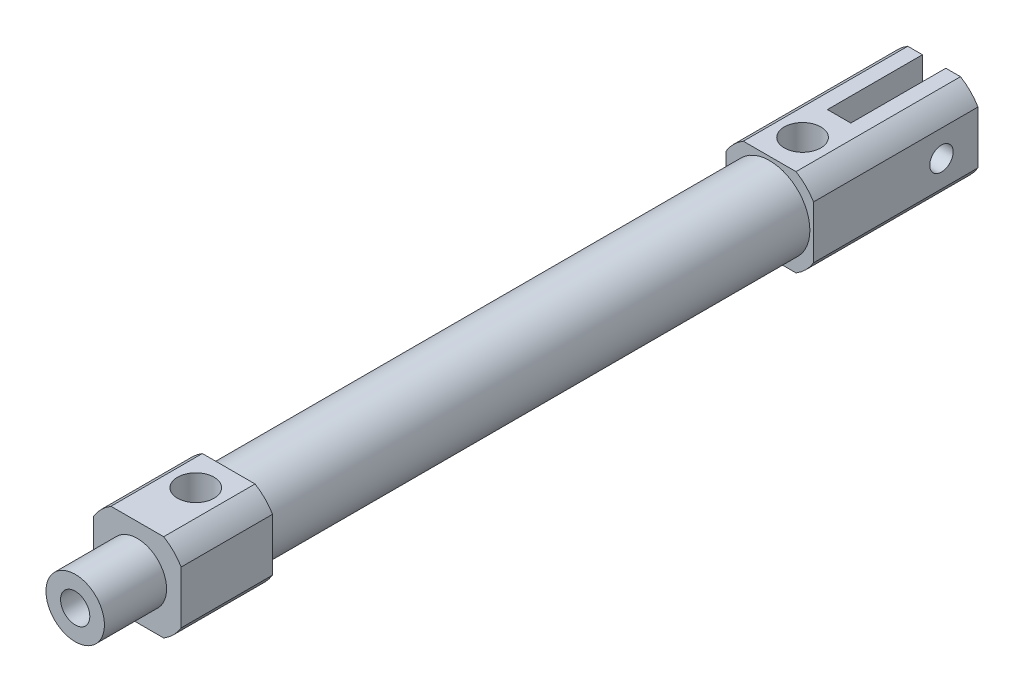
ISO-10303-21;
HEADER;
FILE_DESCRIPTION(('STEP AP214'),'2;1');
FILE_NAME('part.step','',(''),(''),'','','');
FILE_SCHEMA(('AUTOMOTIVE_DESIGN { 1 0 10303 214 1 1 1 1 }'));
ENDSEC;
DATA;
#1=APPLICATION_CONTEXT('core data for automotive mechanical design processes');
#2=APPLICATION_PROTOCOL_DEFINITION('international standard','automotive_design',2000,#1);
#3=PRODUCT_CONTEXT('',#1,'mechanical');
#4=PRODUCT('Part','Part','',(#3));
#5=PRODUCT_RELATED_PRODUCT_CATEGORY('part','',(#4));
#6=PRODUCT_DEFINITION_FORMATION('','',#4);
#7=PRODUCT_DEFINITION_CONTEXT('part definition',#1,'design');
#8=PRODUCT_DEFINITION('design','',#6,#7);
#9=PRODUCT_DEFINITION_SHAPE('','',#8);
#10=(LENGTH_UNIT() NAMED_UNIT(*) SI_UNIT(.MILLI.,.METRE.));
#11=(NAMED_UNIT(*) PLANE_ANGLE_UNIT() SI_UNIT($,.RADIAN.));
#12=(NAMED_UNIT(*) SI_UNIT($,.STERADIAN.) SOLID_ANGLE_UNIT());
#13=UNCERTAINTY_MEASURE_WITH_UNIT(LENGTH_MEASURE(1.E-05),#10,'distance_accuracy_value','');
#14=(GEOMETRIC_REPRESENTATION_CONTEXT(3) GLOBAL_UNCERTAINTY_ASSIGNED_CONTEXT((#13)) GLOBAL_UNIT_ASSIGNED_CONTEXT((#10,
#11,#12)) REPRESENTATION_CONTEXT('',''));
#15=CARTESIAN_POINT('',(0.,0.,0.));
#16=DIRECTION('',(0.,0.,1.));
#17=DIRECTION('',(1.,0.,0.));
#18=AXIS2_PLACEMENT_3D('',#15,#16,#17);
#19=CARTESIAN_POINT('',(0.,0.,67.5));
#20=DIRECTION('',(0.,0.,1.));
#21=DIRECTION('',(1.,0.,0.));
#22=AXIS2_PLACEMENT_3D('',#19,#20,#21);
#23=CYLINDRICAL_SURFACE('',#22,2.);
#24=CARTESIAN_POINT('',(0.,0.,96.5));
#25=DIRECTION('',(0.,0.,1.));
#26=DIRECTION('',(1.,0.,0.));
#27=AXIS2_PLACEMENT_3D('',#24,#25,#26);
#28=CIRCLE('',#27,2.);
#29=CARTESIAN_POINT('',(2.,0.,96.5));
#30=VERTEX_POINT('',#29);
#31=EDGE_CURVE('E295',#30,#30,#28,.T.);
#32=ORIENTED_EDGE('',*,*,#31,.F.);
#33=EDGE_LOOP('',(#32));
#34=FACE_BOUND('',#33,.T.);
#35=CARTESIAN_POINT('',(0.,0.,117.5));
#36=DIRECTION('',(0.,0.,1.));
#37=DIRECTION('',(1.,0.,0.));
#38=AXIS2_PLACEMENT_3D('',#35,#36,#37);
#39=CIRCLE('',#38,2.);
#40=CARTESIAN_POINT('',(2.,0.,117.5));
#41=VERTEX_POINT('',#40);
#42=EDGE_CURVE('E298',#41,#41,#39,.T.);
#43=ORIENTED_EDGE('',*,*,#42,.T.);
#44=EDGE_LOOP('',(#43));
#45=FACE_BOUND('',#44,.T.);
#46=DIRECTION('',(0.,0.,1.));
#47=VECTOR('',#46,1.);
#48=CARTESIAN_POINT('',(-1.73205080756888,0.999999999999999,67.5));
#49=LINE('',#48,#47);
#50=CARTESIAN_POINT('',(-1.73205080756888,0.999999999999999,102.802775637732));
#51=VERTEX_POINT('',#50);
#52=CARTESIAN_POINT('',(-1.73205080756888,0.999999999999999,99.197224362268));
#53=VERTEX_POINT('',#52);
#54=EDGE_CURVE('E11',#51,#53,#49,.F.);
#55=ORIENTED_EDGE('',*,*,#54,.F.);
#56=CARTESIAN_POINT('',(-1.73205080756888,0.999999999999999,102.802775637732));
#57=CARTESIAN_POINT('',(-1.70180340590596,1.05235217667955,102.831851105022));
#58=CARTESIAN_POINT('',(-1.66936724175901,1.10308596600838,102.861536420952));
#59=CARTESIAN_POINT('',(-1.60016196210371,1.20129655732841,102.921343271386));
#60=CARTESIAN_POINT('',(-1.56339000777973,1.24877119287908,102.951465080234));
#61=CARTESIAN_POINT('',(-1.48529774717946,1.34072742223439,103.011551849155));
#62=CARTESIAN_POINT('',(-1.44394454965129,1.38518310886638,103.041513807901));
#63=CARTESIAN_POINT('',(-1.35698378630138,1.47047801547729,103.100321589682));
#64=CARTESIAN_POINT('',(-1.31137761962109,1.51131841625427,103.129167775395));
#65=CARTESIAN_POINT('',(-1.18515973290183,1.61420109975456,103.203102196183));
#66=CARTESIAN_POINT('',(-1.10091322310469,1.6729669950167,103.246691810672));
#67=CARTESIAN_POINT('',(-0.921828665000511,1.77790470937274,103.325891208673));
#68=CARTESIAN_POINT('',(-0.827027200635061,1.82411823060439,103.361527343489));
#69=CARTESIAN_POINT('',(-0.644394347536598,1.89545402766547,103.417091819579));
#70=CARTESIAN_POINT('',(-0.557920862812699,1.92278002216431,103.438629428528));
#71=CARTESIAN_POINT('',(-0.380319463881747,1.96562647597871,103.472552211295));
#72=CARTESIAN_POINT('',(-0.289192402899905,1.9811490911893,103.484939056493));
#73=CARTESIAN_POINT('',(-0.104546449653998,1.99942495989593,103.499533811569));
#74=CARTESIAN_POINT('',(-0.0110209585092099,2.00213805639582,103.501709710675));
#75=CARTESIAN_POINT('',(0.17514497552433,1.99449343865764,103.495595894075));
#76=CARTESIAN_POINT('',(0.267785372349712,1.98413504782758,103.487305636631));
#77=CARTESIAN_POINT('',(0.444649997628176,1.95191083733457,103.461679788203));
#78=CARTESIAN_POINT('',(0.529061846145655,1.93066631056213,103.444832954412));
#79=CARTESIAN_POINT('',(0.692713894786996,1.87817393794106,103.403596073675));
#80=CARTESIAN_POINT('',(0.771954223290153,1.84692634052532,103.379206214065));
#81=CARTESIAN_POINT('',(0.931585843575021,1.77219241893508,103.321646404972));
#82=CARTESIAN_POINT('',(1.011323675777,1.72780458636655,103.287848798381));
#83=CARTESIAN_POINT('',(1.16249466180109,1.62994970675901,103.214874141551));
#84=CARTESIAN_POINT('',(1.23391150673112,1.57646531888343,103.175686844723));
#85=CARTESIAN_POINT('',(1.34438092756411,1.48186223730549,103.108372436963));
#86=CARTESIAN_POINT('',(1.38599029783498,1.44299879971055,103.081195220736));
#87=CARTESIAN_POINT('',(1.46550470295002,1.3621707603566,103.02599070921));
#88=CARTESIAN_POINT('',(1.50340862116661,1.32020523044032,102.99796316098));
#89=CARTESIAN_POINT('',(1.57530664385549,1.23351995647907,102.941771904566));
#90=CARTESIAN_POINT('',(1.60931694210718,1.18881290318085,102.913609308791));
#91=CARTESIAN_POINT('',(1.67353987576498,1.09654289639021,102.857710235056));
#92=CARTESIAN_POINT('',(1.70375446271045,1.04898142921768,102.829973544611));
#93=CARTESIAN_POINT('',(1.73205080756888,1.,102.802775637732));
#94=B_SPLINE_CURVE_WITH_KNOTS('',3,(#56,#57,#58,#59,#60,#61,#62,#63,#64,#65,#66,#67,#68,#69,#70,
#71,#72,#73,#74,#75,#76,#77,#78,#79,#80,#81,#82,#83,#84,#85,#86,#87,#88,#89,#90,#91,#92,#93),
.UNSPECIFIED.,.F.,.F.,(4,2,2,2,2,2,2,2,2,2,2,2,2,2,2,2,2,2,4),(0.,0.201194553749276,
0.402521576863728,0.605401303340197,0.808214520346274,1.14159044276123,1.47384486972872,
1.75228686158415,2.03067798360154,2.30994126650694,2.58921900492483,2.8540875725925,
3.11894956258398,3.40986416210353,3.70133968118178,3.89043458303677,4.07958629358351,
4.26792030046941,4.45615707691472),.UNSPECIFIED.);
#95=CARTESIAN_POINT('',(1.73205080756888,0.999999999999999,102.802775637732));
#96=VERTEX_POINT('',#95);
#97=EDGE_CURVE('E195',#51,#96,#94,.T.);
#98=ORIENTED_EDGE('',*,*,#97,.T.);
#99=DIRECTION('',(0.,0.,1.));
#100=VECTOR('',#99,1.);
#101=CARTESIAN_POINT('',(1.73205080756888,0.999999999999999,67.5));
#102=LINE('',#101,#100);
#103=CARTESIAN_POINT('',(1.73205080756888,0.999999999999999,99.197224362268));
#104=VERTEX_POINT('',#103);
#105=EDGE_CURVE('E47',#104,#96,#102,.T.);
#106=ORIENTED_EDGE('',*,*,#105,.F.);
#107=CARTESIAN_POINT('',(1.73205080756888,0.999999999999999,99.197224362268));
#108=CARTESIAN_POINT('',(1.70180340590596,1.05235217667955,99.1681488949777));
#109=CARTESIAN_POINT('',(1.66936724175901,1.10308596600839,99.1384635790484));
#110=CARTESIAN_POINT('',(1.60016196210371,1.20129655732841,99.0786567286142));
#111=CARTESIAN_POINT('',(1.56339000777973,1.24877119287908,99.0485349197655));
#112=CARTESIAN_POINT('',(1.48529774717946,1.3407274222344,98.9884481508453));
#113=CARTESIAN_POINT('',(1.44394454965128,1.38518310886639,98.9584861920986));
#114=CARTESIAN_POINT('',(1.35698378630138,1.4704780154773,98.8996784103181));
#115=CARTESIAN_POINT('',(1.31137761962108,1.51131841625427,98.8708322246049));
#116=CARTESIAN_POINT('',(1.18515973290183,1.61420109975456,98.796897803817));
#117=CARTESIAN_POINT('',(1.10091322310469,1.6729669950167,98.7533081893281));
#118=CARTESIAN_POINT('',(0.921828665000511,1.77790470937274,98.6741087913273));
#119=CARTESIAN_POINT('',(0.827027200635061,1.82411823060439,98.6384726565113));
#120=CARTESIAN_POINT('',(0.644394347536598,1.89545402766547,98.5829081804215));
#121=CARTESIAN_POINT('',(0.557920862812699,1.92278002216431,98.5613705714717));
#122=CARTESIAN_POINT('',(0.380319463881747,1.96562647597871,98.5274477887051));
#123=CARTESIAN_POINT('',(0.289192402899905,1.9811490911893,98.5150609435072));
#124=CARTESIAN_POINT('',(0.104546449653998,1.99942495989593,98.5004661884315));
#125=CARTESIAN_POINT('',(0.0110209585092096,2.00213805639582,98.4982902893252));
#126=CARTESIAN_POINT('',(-0.17514497552433,1.99449343865764,98.504404105925));
#127=CARTESIAN_POINT('',(-0.267785372349712,1.98413504782758,98.5126943633689));
#128=CARTESIAN_POINT('',(-0.444649997628177,1.95191083733457,98.5383202117974));
#129=CARTESIAN_POINT('',(-0.529061846145657,1.93066631056213,98.5551670455876));
#130=CARTESIAN_POINT('',(-0.692713894786998,1.87817393794106,98.5964039263247));
#131=CARTESIAN_POINT('',(-0.771954223290153,1.84692634052532,98.6207937859351));
#132=CARTESIAN_POINT('',(-0.931585843575021,1.77219241893508,98.6783535950278));
#133=CARTESIAN_POINT('',(-1.011323675777,1.72780458636655,98.7121512016188));
#134=CARTESIAN_POINT('',(-1.16249466180109,1.62994970675901,98.7851258584489));
#135=CARTESIAN_POINT('',(-1.23391150673112,1.57646531888343,98.8243131552769));
#136=CARTESIAN_POINT('',(-1.34438092756411,1.48186223730549,98.8916275630367));
#137=CARTESIAN_POINT('',(-1.38599029783498,1.44299879971054,98.9188047792638));
#138=CARTESIAN_POINT('',(-1.46550470295002,1.36217076035659,98.9740092907897));
#139=CARTESIAN_POINT('',(-1.50340862116661,1.32020523044032,99.0020368390201));
#140=CARTESIAN_POINT('',(-1.57530664385549,1.23351995647907,99.0582280954341));
#141=CARTESIAN_POINT('',(-1.60931694210717,1.18881290318086,99.0863906912087));
#142=CARTESIAN_POINT('',(-1.67353987576498,1.09654289639021,99.1422897649443));
#143=CARTESIAN_POINT('',(-1.70375446271045,1.04898142921768,99.1700264553892));
#144=CARTESIAN_POINT('',(-1.73205080756888,1.,99.197224362268));
#145=B_SPLINE_CURVE_WITH_KNOTS('',3,(#107,#108,#109,#110,#111,#112,#113,#114,#115,#116,#117,
#118,#119,#120,#121,#122,#123,#124,#125,#126,#127,#128,#129,#130,#131,#132,#133,#134,#135,#136,
#137,#138,#139,#140,#141,#142,#143,#144),.UNSPECIFIED.,.F.,.F.,(4,2,2,2,2,2,2,2,2,2,2,2,2,2,2,2,
2,2,4),(0.,0.201194553749276,0.402521576863728,0.605401303340207,0.808214520346274,
1.14159044276123,1.47384486972872,1.75228686158415,2.03067798360154,2.30994126650694,
2.58921900492483,2.8540875725925,3.11894956258398,3.40986416210353,3.70133968118178,
3.89043458303678,4.07958629358351,4.26792030046941,4.45615707691472),.UNSPECIFIED.);
#146=EDGE_CURVE('E197',#104,#53,#145,.T.);
#147=ORIENTED_EDGE('',*,*,#146,.T.);
#148=EDGE_LOOP('',(#55,#98,#106,#147));
#149=FACE_BOUND('',#148,.T.);
#150=ADVANCED_FACE('F38',(#34,#45,#149),#23,.F.);
#151=CARTESIAN_POINT('',(0.,0.,0.));
#152=DIRECTION('',(0.,0.,1.));
#153=DIRECTION('',(1.,0.,0.));
#154=AXIS2_PLACEMENT_3D('',#151,#152,#153);
#155=PLANE('',#154);
#156=DIRECTION('',(-1.,0.,0.));
#157=VECTOR('',#156,1.);
#158=CARTESIAN_POINT('',(-6.,6.,0.));
#159=LINE('',#158,#157);
#160=CARTESIAN_POINT('',(-1.6,6.,0.));
#161=VERTEX_POINT('',#160);
#162=CARTESIAN_POINT('',(-3.60555127546399,6.,0.));
#163=VERTEX_POINT('',#162);
#164=EDGE_CURVE('E423',#161,#163,#159,.T.);
#165=ORIENTED_EDGE('',*,*,#164,.F.);
#166=DIRECTION('',(0.,1.,0.));
#167=VECTOR('',#166,1.);
#168=CARTESIAN_POINT('',(-1.6,6.,0.));
#169=LINE('',#168,#167);
#170=CARTESIAN_POINT('',(-1.6,-6.,0.));
#171=VERTEX_POINT('',#170);
#172=EDGE_CURVE('E378',#171,#161,#169,.T.);
#173=ORIENTED_EDGE('',*,*,#172,.F.);
#174=DIRECTION('',(1.,0.,0.));
#175=VECTOR('',#174,1.);
#176=CARTESIAN_POINT('',(-6.,-6.,0.));
#177=LINE('',#176,#175);
#178=CARTESIAN_POINT('',(-3.60555127546399,-6.,0.));
#179=VERTEX_POINT('',#178);
#180=EDGE_CURVE('E433',#179,#171,#177,.T.);
#181=ORIENTED_EDGE('',*,*,#180,.F.);
#182=CARTESIAN_POINT('',(0.,0.,0.));
#183=DIRECTION('',(0.,0.,1.));
#184=DIRECTION('',(1.,0.,0.));
#185=AXIS2_PLACEMENT_3D('',#182,#183,#184);
#186=CIRCLE('',#185,7.);
#187=CARTESIAN_POINT('',(-6.,-3.60555127546399,0.));
#188=VERTEX_POINT('',#187);
#189=EDGE_CURVE('E547',#188,#179,#186,.T.);
#190=ORIENTED_EDGE('',*,*,#189,.F.);
#191=DIRECTION('',(0.,-1.,0.));
#192=VECTOR('',#191,1.);
#193=CARTESIAN_POINT('',(-6.,6.,0.));
#194=LINE('',#193,#192);
#195=CARTESIAN_POINT('',(-6.,3.60555127546399,0.));
#196=VERTEX_POINT('',#195);
#197=EDGE_CURVE('E429',#196,#188,#194,.T.);
#198=ORIENTED_EDGE('',*,*,#197,.F.);
#199=EDGE_CURVE('E355',#163,#196,#186,.T.);
#200=ORIENTED_EDGE('',*,*,#199,.F.);
#201=EDGE_LOOP('',(#165,#173,#181,#190,#198,#200));
#202=FACE_BOUND('',#201,.T.);
#203=ADVANCED_FACE('F283',(#202),#155,.F.);
#204=CARTESIAN_POINT('',(0.,0.,22.5));
#205=DIRECTION('',(0.,0.,-1.));
#206=DIRECTION('',(-1.,0.,0.));
#207=AXIS2_PLACEMENT_3D('',#204,#205,#206);
#208=CYLINDRICAL_SURFACE('',#207,7.);
#209=DIRECTION('',(0.,0.,-1.));
#210=VECTOR('',#209,1.);
#211=CARTESIAN_POINT('',(6.,-3.60555127546399,22.5));
#212=LINE('',#211,#210);
#213=CARTESIAN_POINT('',(6.,-3.60555127546399,22.5));
#214=VERTEX_POINT('',#213);
#215=CARTESIAN_POINT('',(6.,-3.60555127546399,0.));
#216=VERTEX_POINT('',#215);
#217=EDGE_CURVE('E301',#214,#216,#212,.T.);
#218=ORIENTED_EDGE('',*,*,#217,.F.);
#219=CARTESIAN_POINT('',(0.,0.,22.5));
#220=DIRECTION('',(0.,0.,1.));
#221=DIRECTION('',(1.,0.,0.));
#222=AXIS2_PLACEMENT_3D('',#219,#220,#221);
#223=CIRCLE('',#222,7.);
#224=CARTESIAN_POINT('',(3.60555127546399,-6.,22.5));
#225=VERTEX_POINT('',#224);
#226=EDGE_CURVE('E350',#225,#214,#223,.T.);
#227=ORIENTED_EDGE('',*,*,#226,.F.);
#228=DIRECTION('',(0.,0.,-1.));
#229=VECTOR('',#228,1.);
#230=CARTESIAN_POINT('',(3.60555127546399,-6.,22.5));
#231=LINE('',#230,#229);
#232=CARTESIAN_POINT('',(3.60555127546399,-6.,0.));
#233=VERTEX_POINT('',#232);
#234=EDGE_CURVE('E493',#233,#225,#231,.F.);
#235=ORIENTED_EDGE('',*,*,#234,.F.);
#236=EDGE_CURVE('E341',#233,#216,#186,.T.);
#237=ORIENTED_EDGE('',*,*,#236,.T.);
#238=EDGE_LOOP('',(#218,#227,#235,#237));
#239=FACE_BOUND('',#238,.T.);
#240=ADVANCED_FACE('F40',(#239),#208,.T.);
#241=DIRECTION('',(0.,0.,-1.));
#242=VECTOR('',#241,1.);
#243=CARTESIAN_POINT('',(6.,3.60555127546399,22.5));
#244=LINE('',#243,#242);
#245=CARTESIAN_POINT('',(6.,3.60555127546399,0.));
#246=VERTEX_POINT('',#245);
#247=CARTESIAN_POINT('',(6.,3.60555127546399,22.5));
#248=VERTEX_POINT('',#247);
#249=EDGE_CURVE('E307',#246,#248,#244,.F.);
#250=ORIENTED_EDGE('',*,*,#249,.F.);
#251=CARTESIAN_POINT('',(3.60555127546399,6.,0.));
#252=VERTEX_POINT('',#251);
#253=EDGE_CURVE('E351',#246,#252,#186,.T.);
#254=ORIENTED_EDGE('',*,*,#253,.T.);
#255=DIRECTION('',(0.,0.,-1.));
#256=VECTOR('',#255,1.);
#257=CARTESIAN_POINT('',(3.60555127546399,6.,22.5));
#258=LINE('',#257,#256);
#259=CARTESIAN_POINT('',(3.60555127546399,6.,22.5));
#260=VERTEX_POINT('',#259);
#261=EDGE_CURVE('E464',#260,#252,#258,.T.);
#262=ORIENTED_EDGE('',*,*,#261,.F.);
#263=EDGE_CURVE('E345',#248,#260,#223,.T.);
#264=ORIENTED_EDGE('',*,*,#263,.F.);
#265=EDGE_LOOP('',(#250,#254,#262,#264));
#266=FACE_BOUND('',#265,.T.);
#267=ADVANCED_FACE('F520',(#266),#208,.T.);
#268=DIRECTION('',(0.,0.,-1.));
#269=VECTOR('',#268,1.);
#270=CARTESIAN_POINT('',(-3.60555127546399,-6.,22.5));
#271=LINE('',#270,#269);
#272=CARTESIAN_POINT('',(-3.60555127546399,-6.,22.5));
#273=VERTEX_POINT('',#272);
#274=EDGE_CURVE('E496',#273,#179,#271,.T.);
#275=ORIENTED_EDGE('',*,*,#274,.F.);
#276=CARTESIAN_POINT('',(-6.,-3.60555127546399,22.5));
#277=VERTEX_POINT('',#276);
#278=EDGE_CURVE('E558',#277,#273,#223,.T.);
#279=ORIENTED_EDGE('',*,*,#278,.F.);
#280=DIRECTION('',(0.,0.,-1.));
#281=VECTOR('',#280,1.);
#282=CARTESIAN_POINT('',(-6.,-3.60555127546399,22.5));
#283=LINE('',#282,#281);
#284=EDGE_CURVE('E477',#188,#277,#283,.F.);
#285=ORIENTED_EDGE('',*,*,#284,.F.);
#286=ORIENTED_EDGE('',*,*,#189,.T.);
#287=EDGE_LOOP('',(#275,#279,#285,#286));
#288=FACE_BOUND('',#287,.T.);
#289=ADVANCED_FACE('F566',(#288),#208,.T.);
#290=DIRECTION('',(0.,0.,-1.));
#291=VECTOR('',#290,1.);
#292=CARTESIAN_POINT('',(-6.,3.60555127546399,22.5));
#293=LINE('',#292,#291);
#294=CARTESIAN_POINT('',(-6.,3.60555127546399,22.5));
#295=VERTEX_POINT('',#294);
#296=EDGE_CURVE('E480',#295,#196,#293,.T.);
#297=ORIENTED_EDGE('',*,*,#296,.F.);
#298=CARTESIAN_POINT('',(-3.60555127546399,6.,22.5));
#299=VERTEX_POINT('',#298);
#300=EDGE_CURVE('E349',#299,#295,#223,.T.);
#301=ORIENTED_EDGE('',*,*,#300,.F.);
#302=DIRECTION('',(0.,0.,-1.));
#303=VECTOR('',#302,1.);
#304=CARTESIAN_POINT('',(-3.60555127546399,6.,22.5));
#305=LINE('',#304,#303);
#306=EDGE_CURVE('E461',#163,#299,#305,.F.);
#307=ORIENTED_EDGE('',*,*,#306,.F.);
#308=ORIENTED_EDGE('',*,*,#199,.T.);
#309=EDGE_LOOP('',(#297,#301,#307,#308));
#310=FACE_BOUND('',#309,.T.);
#311=ADVANCED_FACE('F564',(#310),#208,.T.);
#312=CARTESIAN_POINT('',(0.,0.,22.5));
#313=DIRECTION('',(0.,0.,1.));
#314=DIRECTION('',(1.,0.,0.));
#315=AXIS2_PLACEMENT_3D('',#312,#313,#314);
#316=PLANE('',#315);
#317=CARTESIAN_POINT('',(0.,0.,22.5));
#318=DIRECTION('',(0.,0.,1.));
#319=DIRECTION('',(1.,0.,0.));
#320=AXIS2_PLACEMENT_3D('',#317,#318,#319);
#321=CIRCLE('',#320,5.5);
#322=CARTESIAN_POINT('',(5.5,0.,22.5));
#323=VERTEX_POINT('',#322);
#324=EDGE_CURVE('E336',#323,#323,#321,.T.);
#325=ORIENTED_EDGE('',*,*,#324,.F.);
#326=EDGE_LOOP('',(#325));
#327=FACE_BOUND('',#326,.T.);
#328=ORIENTED_EDGE('',*,*,#226,.T.);
#329=DIRECTION('',(0.,1.,0.));
#330=VECTOR('',#329,1.);
#331=CARTESIAN_POINT('',(6.,0.,22.5));
#332=LINE('',#331,#330);
#333=EDGE_CURVE('E505',#214,#248,#332,.T.);
#334=ORIENTED_EDGE('',*,*,#333,.T.);
#335=ORIENTED_EDGE('',*,*,#263,.T.);
#336=DIRECTION('',(-1.,0.,0.));
#337=VECTOR('',#336,1.);
#338=CARTESIAN_POINT('',(0.,6.,22.5));
#339=LINE('',#338,#337);
#340=EDGE_CURVE('E457',#260,#299,#339,.T.);
#341=ORIENTED_EDGE('',*,*,#340,.T.);
#342=ORIENTED_EDGE('',*,*,#300,.T.);
#343=DIRECTION('',(0.,-1.,0.));
#344=VECTOR('',#343,1.);
#345=CARTESIAN_POINT('',(-6.,0.,22.5));
#346=LINE('',#345,#344);
#347=EDGE_CURVE('E473',#295,#277,#346,.T.);
#348=ORIENTED_EDGE('',*,*,#347,.T.);
#349=ORIENTED_EDGE('',*,*,#278,.T.);
#350=DIRECTION('',(1.,0.,0.));
#351=VECTOR('',#350,1.);
#352=CARTESIAN_POINT('',(0.,-6.,22.5));
#353=LINE('',#352,#351);
#354=EDGE_CURVE('E489',#273,#225,#353,.T.);
#355=ORIENTED_EDGE('',*,*,#354,.T.);
#356=EDGE_LOOP('',(#328,#334,#335,#341,#342,#348,#349,#355));
#357=FACE_BOUND('',#356,.T.);
#358=ADVANCED_FACE('F517',(#327,#357),#316,.T.);
#359=CARTESIAN_POINT('',(1.6,-6.,0.));
#360=VERTEX_POINT('',#359);
#361=EDGE_CURVE('E432',#360,#233,#177,.T.);
#362=ORIENTED_EDGE('',*,*,#361,.F.);
#363=DIRECTION('',(0.,-1.,0.));
#364=VECTOR('',#363,1.);
#365=CARTESIAN_POINT('',(1.6,6.,0.));
#366=LINE('',#365,#364);
#367=CARTESIAN_POINT('',(1.6,6.,0.));
#368=VERTEX_POINT('',#367);
#369=EDGE_CURVE('E393',#368,#360,#366,.T.);
#370=ORIENTED_EDGE('',*,*,#369,.F.);
#371=EDGE_CURVE('E425',#252,#368,#159,.T.);
#372=ORIENTED_EDGE('',*,*,#371,.F.);
#373=ORIENTED_EDGE('',*,*,#253,.F.);
#374=DIRECTION('',(0.,1.,0.));
#375=VECTOR('',#374,1.);
#376=CARTESIAN_POINT('',(6.,6.,0.));
#377=LINE('',#376,#375);
#378=EDGE_CURVE('E420',#216,#246,#377,.T.);
#379=ORIENTED_EDGE('',*,*,#378,.F.);
#380=ORIENTED_EDGE('',*,*,#236,.F.);
#381=EDGE_LOOP('',(#362,#370,#372,#373,#379,#380));
#382=FACE_BOUND('',#381,.T.);
#383=ADVANCED_FACE('F291',(#382),#155,.F.);
#384=CARTESIAN_POINT('',(0.,0.,109.));
#385=DIRECTION('',(0.,0.,-1.));
#386=DIRECTION('',(-1.,0.,0.));
#387=AXIS2_PLACEMENT_3D('',#384,#385,#386);
#388=CYLINDRICAL_SURFACE('',#387,7.);
#389=DIRECTION('',(0.,0.,-1.));
#390=VECTOR('',#389,1.);
#391=CARTESIAN_POINT('',(6.,-3.60555127546399,109.));
#392=LINE('',#391,#390);
#393=CARTESIAN_POINT('',(6.,-3.60555127546399,109.));
#394=VERTEX_POINT('',#393);
#395=CARTESIAN_POINT('',(6.,-3.60555127546399,96.5));
#396=VERTEX_POINT('',#395);
#397=EDGE_CURVE('E502',#394,#396,#392,.T.);
#398=ORIENTED_EDGE('',*,*,#397,.F.);
#399=CARTESIAN_POINT('',(0.,0.,109.));
#400=DIRECTION('',(0.,0.,1.));
#401=DIRECTION('',(1.,0.,0.));
#402=AXIS2_PLACEMENT_3D('',#399,#400,#401);
#403=CIRCLE('',#402,7.);
#404=CARTESIAN_POINT('',(3.60555127546399,-6.,109.));
#405=VERTEX_POINT('',#404);
#406=EDGE_CURVE('E327',#405,#394,#403,.T.);
#407=ORIENTED_EDGE('',*,*,#406,.F.);
#408=DIRECTION('',(0.,0.,-1.));
#409=VECTOR('',#408,1.);
#410=CARTESIAN_POINT('',(3.60555127546399,-6.,109.));
#411=LINE('',#410,#409);
#412=CARTESIAN_POINT('',(3.60555127546399,-6.,96.5));
#413=VERTEX_POINT('',#412);
#414=EDGE_CURVE('E483',#413,#405,#411,.F.);
#415=ORIENTED_EDGE('',*,*,#414,.F.);
#416=CARTESIAN_POINT('',(0.,0.,96.5));
#417=DIRECTION('',(0.,0.,1.));
#418=DIRECTION('',(1.,0.,0.));
#419=AXIS2_PLACEMENT_3D('',#416,#417,#418);
#420=CIRCLE('',#419,7.);
#421=EDGE_CURVE('E314',#413,#396,#420,.T.);
#422=ORIENTED_EDGE('',*,*,#421,.T.);
#423=EDGE_LOOP('',(#398,#407,#415,#422));
#424=FACE_BOUND('',#423,.T.);
#425=ADVANCED_FACE('F647',(#424),#388,.T.);
#426=DIRECTION('',(0.,0.,-1.));
#427=VECTOR('',#426,1.);
#428=CARTESIAN_POINT('',(6.,3.60555127546399,109.));
#429=LINE('',#428,#427);
#430=CARTESIAN_POINT('',(6.,3.60555127546399,96.5));
#431=VERTEX_POINT('',#430);
#432=CARTESIAN_POINT('',(6.,3.60555127546399,109.));
#433=VERTEX_POINT('',#432);
#434=EDGE_CURVE('E499',#431,#433,#429,.F.);
#435=ORIENTED_EDGE('',*,*,#434,.F.);
#436=CARTESIAN_POINT('',(3.60555127546399,6.,96.5));
#437=VERTEX_POINT('',#436);
#438=EDGE_CURVE('E328',#431,#437,#420,.T.);
#439=ORIENTED_EDGE('',*,*,#438,.T.);
#440=DIRECTION('',(0.,0.,-1.));
#441=VECTOR('',#440,1.);
#442=CARTESIAN_POINT('',(3.60555127546399,6.,109.));
#443=LINE('',#442,#441);
#444=CARTESIAN_POINT('',(3.60555127546399,6.,109.));
#445=VERTEX_POINT('',#444);
#446=EDGE_CURVE('E454',#445,#437,#443,.T.);
#447=ORIENTED_EDGE('',*,*,#446,.F.);
#448=EDGE_CURVE('E321',#433,#445,#403,.T.);
#449=ORIENTED_EDGE('',*,*,#448,.F.);
#450=EDGE_LOOP('',(#435,#439,#447,#449));
#451=FACE_BOUND('',#450,.T.);
#452=ADVANCED_FACE('F651',(#451),#388,.T.);
#453=DIRECTION('',(0.,0.,-1.));
#454=VECTOR('',#453,1.);
#455=CARTESIAN_POINT('',(-3.60555127546399,-6.,109.));
#456=LINE('',#455,#454);
#457=CARTESIAN_POINT('',(-3.60555127546399,-6.,109.));
#458=VERTEX_POINT('',#457);
#459=CARTESIAN_POINT('',(-3.60555127546399,-6.,96.5));
#460=VERTEX_POINT('',#459);
#461=EDGE_CURVE('E486',#458,#460,#456,.T.);
#462=ORIENTED_EDGE('',*,*,#461,.F.);
#463=CARTESIAN_POINT('',(-6.,-3.60555127546399,109.));
#464=VERTEX_POINT('',#463);
#465=EDGE_CURVE('E683',#464,#458,#403,.T.);
#466=ORIENTED_EDGE('',*,*,#465,.F.);
#467=DIRECTION('',(0.,0.,-1.));
#468=VECTOR('',#467,1.);
#469=CARTESIAN_POINT('',(-6.,-3.60555127546399,109.));
#470=LINE('',#469,#468);
#471=CARTESIAN_POINT('',(-6.,-3.60555127546399,96.5));
#472=VERTEX_POINT('',#471);
#473=EDGE_CURVE('E467',#472,#464,#470,.F.);
#474=ORIENTED_EDGE('',*,*,#473,.F.);
#475=EDGE_CURVE('E701',#472,#460,#420,.T.);
#476=ORIENTED_EDGE('',*,*,#475,.T.);
#477=EDGE_LOOP('',(#462,#466,#474,#476));
#478=FACE_BOUND('',#477,.T.);
#479=ADVANCED_FACE('F657',(#478),#388,.T.);
#480=DIRECTION('',(0.,0.,-1.));
#481=VECTOR('',#480,1.);
#482=CARTESIAN_POINT('',(-6.,3.60555127546399,109.));
#483=LINE('',#482,#481);
#484=CARTESIAN_POINT('',(-6.,3.60555127546399,109.));
#485=VERTEX_POINT('',#484);
#486=CARTESIAN_POINT('',(-6.,3.60555127546399,96.5));
#487=VERTEX_POINT('',#486);
#488=EDGE_CURVE('E470',#485,#487,#483,.T.);
#489=ORIENTED_EDGE('',*,*,#488,.F.);
#490=CARTESIAN_POINT('',(-3.60555127546399,6.,109.));
#491=VERTEX_POINT('',#490);
#492=EDGE_CURVE('E326',#491,#485,#403,.T.);
#493=ORIENTED_EDGE('',*,*,#492,.F.);
#494=DIRECTION('',(0.,0.,-1.));
#495=VECTOR('',#494,1.);
#496=CARTESIAN_POINT('',(-3.60555127546399,6.,109.));
#497=LINE('',#496,#495);
#498=CARTESIAN_POINT('',(-3.60555127546399,6.,96.5));
#499=VERTEX_POINT('',#498);
#500=EDGE_CURVE('E437',#499,#491,#497,.F.);
#501=ORIENTED_EDGE('',*,*,#500,.F.);
#502=EDGE_CURVE('E332',#499,#487,#420,.T.);
#503=ORIENTED_EDGE('',*,*,#502,.T.);
#504=EDGE_LOOP('',(#489,#493,#501,#503));
#505=FACE_BOUND('',#504,.T.);
#506=ADVANCED_FACE('F653',(#505),#388,.T.);
#507=CARTESIAN_POINT('',(0.,0.,109.));
#508=DIRECTION('',(0.,0.,1.));
#509=DIRECTION('',(1.,0.,0.));
#510=AXIS2_PLACEMENT_3D('',#507,#508,#509);
#511=PLANE('',#510);
#512=CARTESIAN_POINT('',(0.,0.,109.));
#513=DIRECTION('',(0.,0.,1.));
#514=DIRECTION('',(1.,0.,0.));
#515=AXIS2_PLACEMENT_3D('',#512,#513,#514);
#516=CIRCLE('',#515,4.);
#517=CARTESIAN_POINT('',(4.,0.,109.));
#518=VERTEX_POINT('',#517);
#519=EDGE_CURVE('E315',#518,#518,#516,.T.);
#520=ORIENTED_EDGE('',*,*,#519,.F.);
#521=EDGE_LOOP('',(#520));
#522=FACE_BOUND('',#521,.T.);
#523=ORIENTED_EDGE('',*,*,#406,.T.);
#524=DIRECTION('',(0.,1.,0.));
#525=VECTOR('',#524,1.);
#526=CARTESIAN_POINT('',(6.,6.,109.));
#527=LINE('',#526,#525);
#528=EDGE_CURVE('E409',#394,#433,#527,.T.);
#529=ORIENTED_EDGE('',*,*,#528,.T.);
#530=ORIENTED_EDGE('',*,*,#448,.T.);
#531=DIRECTION('',(-1.,0.,0.));
#532=VECTOR('',#531,1.);
#533=CARTESIAN_POINT('',(-6.,6.,109.));
#534=LINE('',#533,#532);
#535=EDGE_CURVE('E441',#445,#491,#534,.T.);
#536=ORIENTED_EDGE('',*,*,#535,.T.);
#537=ORIENTED_EDGE('',*,*,#492,.T.);
#538=DIRECTION('',(0.,-1.,0.));
#539=VECTOR('',#538,1.);
#540=CARTESIAN_POINT('',(-6.,6.,109.));
#541=LINE('',#540,#539);
#542=EDGE_CURVE('E445',#485,#464,#541,.T.);
#543=ORIENTED_EDGE('',*,*,#542,.T.);
#544=ORIENTED_EDGE('',*,*,#465,.T.);
#545=DIRECTION('',(1.,0.,0.));
#546=VECTOR('',#545,1.);
#547=CARTESIAN_POINT('',(-6.,-6.,109.));
#548=LINE('',#547,#546);
#549=EDGE_CURVE('E424',#458,#405,#548,.T.);
#550=ORIENTED_EDGE('',*,*,#549,.T.);
#551=EDGE_LOOP('',(#523,#529,#530,#536,#537,#543,#544,#550));
#552=FACE_BOUND('',#551,.T.);
#553=ADVANCED_FACE('F661',(#522,#552),#511,.T.);
#554=CARTESIAN_POINT('',(0.,0.,96.5));
#555=DIRECTION('',(0.,0.,1.));
#556=DIRECTION('',(1.,0.,0.));
#557=AXIS2_PLACEMENT_3D('',#554,#555,#556);
#558=PLANE('',#557);
#559=CARTESIAN_POINT('',(0.,0.,96.5));
#560=DIRECTION('',(0.,0.,1.));
#561=DIRECTION('',(1.,0.,0.));
#562=AXIS2_PLACEMENT_3D('',#559,#560,#561);
#563=CIRCLE('',#562,5.5);
#564=CARTESIAN_POINT('',(5.5,0.,96.5));
#565=VERTEX_POINT('',#564);
#566=EDGE_CURVE('E337',#565,#565,#563,.T.);
#567=ORIENTED_EDGE('',*,*,#566,.T.);
#568=EDGE_LOOP('',(#567));
#569=FACE_BOUND('',#568,.T.);
#570=DIRECTION('',(0.,1.,0.));
#571=VECTOR('',#570,1.);
#572=CARTESIAN_POINT('',(6.,0.,96.5));
#573=LINE('',#572,#571);
#574=EDGE_CURVE('E191',#396,#431,#573,.T.);
#575=ORIENTED_EDGE('',*,*,#574,.F.);
#576=ORIENTED_EDGE('',*,*,#421,.F.);
#577=DIRECTION('',(1.,0.,0.));
#578=VECTOR('',#577,1.);
#579=CARTESIAN_POINT('',(0.,-6.,96.5));
#580=LINE('',#579,#578);
#581=EDGE_CURVE('E364',#460,#413,#580,.T.);
#582=ORIENTED_EDGE('',*,*,#581,.F.);
#583=ORIENTED_EDGE('',*,*,#475,.F.);
#584=DIRECTION('',(0.,-1.,0.));
#585=VECTOR('',#584,1.);
#586=CARTESIAN_POINT('',(-6.,0.,96.5));
#587=LINE('',#586,#585);
#588=EDGE_CURVE('E361',#487,#472,#587,.T.);
#589=ORIENTED_EDGE('',*,*,#588,.F.);
#590=ORIENTED_EDGE('',*,*,#502,.F.);
#591=DIRECTION('',(-1.,0.,0.));
#592=VECTOR('',#591,1.);
#593=CARTESIAN_POINT('',(0.,6.,96.5));
#594=LINE('',#593,#592);
#595=EDGE_CURVE('E319',#437,#499,#594,.T.);
#596=ORIENTED_EDGE('',*,*,#595,.F.);
#597=ORIENTED_EDGE('',*,*,#438,.F.);
#598=EDGE_LOOP('',(#575,#576,#582,#583,#589,#590,#596,#597));
#599=FACE_BOUND('',#598,.T.);
#600=ADVANCED_FACE('F603',(#569,#599),#558,.F.);
#601=CARTESIAN_POINT('',(0.,0.,22.5));
#602=DIRECTION('',(0.,0.,1.));
#603=DIRECTION('',(1.,0.,0.));
#604=AXIS2_PLACEMENT_3D('',#601,#602,#603);
#605=CIRCLE('',#604,5.);
#606=CARTESIAN_POINT('',(5.,0.,22.5));
#607=VERTEX_POINT('',#606);
#608=EDGE_CURVE('E320',#607,#607,#605,.F.);
#609=ORIENTED_EDGE('',*,*,#608,.F.);
#610=EDGE_LOOP('',(#609));
#611=FACE_BOUND('',#610,.T.);
#612=ADVANCED_FACE('F617',(#611),#316,.T.);
#613=CARTESIAN_POINT('',(0.,0.,96.5));
#614=DIRECTION('',(0.,0.,-1.));
#615=DIRECTION('',(-1.,0.,0.));
#616=AXIS2_PLACEMENT_3D('',#613,#614,#615);
#617=CYLINDRICAL_SURFACE('',#616,5.);
#618=CARTESIAN_POINT('',(0.,0.,96.5));
#619=DIRECTION('',(0.,0.,1.));
#620=DIRECTION('',(1.,0.,0.));
#621=AXIS2_PLACEMENT_3D('',#618,#619,#620);
#622=CIRCLE('',#621,5.);
#623=CARTESIAN_POINT('',(5.,0.,96.5));
#624=VERTEX_POINT('',#623);
#625=EDGE_CURVE('E325',#624,#624,#622,.T.);
#626=ORIENTED_EDGE('',*,*,#625,.T.);
#627=EDGE_LOOP('',(#626));
#628=FACE_BOUND('',#627,.T.);
#629=ORIENTED_EDGE('',*,*,#608,.T.);
#630=EDGE_LOOP('',(#629));
#631=FACE_BOUND('',#630,.T.);
#632=ADVANCED_FACE('F600',(#628,#631),#617,.F.);
#633=ORIENTED_EDGE('',*,*,#31,.T.);
#634=EDGE_LOOP('',(#633));
#635=FACE_BOUND('',#634,.T.);
#636=ORIENTED_EDGE('',*,*,#625,.F.);
#637=EDGE_LOOP('',(#636));
#638=FACE_BOUND('',#637,.T.);
#639=ADVANCED_FACE('F594',(#635,#638),#558,.F.);
#640=CARTESIAN_POINT('',(0.,0.,96.5));
#641=DIRECTION('',(0.,0.,-1.));
#642=DIRECTION('',(-1.,0.,0.));
#643=AXIS2_PLACEMENT_3D('',#640,#641,#642);
#644=CYLINDRICAL_SURFACE('',#643,5.5);
#645=ORIENTED_EDGE('',*,*,#566,.F.);
#646=EDGE_LOOP('',(#645));
#647=FACE_BOUND('',#646,.T.);
#648=ORIENTED_EDGE('',*,*,#324,.T.);
#649=EDGE_LOOP('',(#648));
#650=FACE_BOUND('',#649,.T.);
#651=ADVANCED_FACE('F599',(#647,#650),#644,.T.);
#652=CARTESIAN_POINT('',(0.,0.,117.5));
#653=DIRECTION('',(0.,0.,-1.));
#654=DIRECTION('',(-1.,0.,0.));
#655=AXIS2_PLACEMENT_3D('',#652,#653,#654);
#656=CYLINDRICAL_SURFACE('',#655,4.);
#657=CARTESIAN_POINT('',(0.,0.,117.5));
#658=DIRECTION('',(0.,0.,1.));
#659=DIRECTION('',(1.,0.,0.));
#660=AXIS2_PLACEMENT_3D('',#657,#658,#659);
#661=CIRCLE('',#660,4.);
#662=CARTESIAN_POINT('',(4.,0.,117.5));
#663=VERTEX_POINT('',#662);
#664=EDGE_CURVE('E305',#663,#663,#661,.T.);
#665=ORIENTED_EDGE('',*,*,#664,.F.);
#666=EDGE_LOOP('',(#665));
#667=FACE_BOUND('',#666,.T.);
#668=ORIENTED_EDGE('',*,*,#519,.T.);
#669=EDGE_LOOP('',(#668));
#670=FACE_BOUND('',#669,.T.);
#671=ADVANCED_FACE('F586',(#667,#670),#656,.T.);
#672=CARTESIAN_POINT('',(0.,0.,117.5));
#673=DIRECTION('',(0.,0.,1.));
#674=DIRECTION('',(1.,0.,0.));
#675=AXIS2_PLACEMENT_3D('',#672,#673,#674);
#676=PLANE('',#675);
#677=ORIENTED_EDGE('',*,*,#42,.F.);
#678=EDGE_LOOP('',(#677));
#679=FACE_BOUND('',#678,.T.);
#680=ORIENTED_EDGE('',*,*,#664,.T.);
#681=EDGE_LOOP('',(#680));
#682=FACE_BOUND('',#681,.T.);
#683=ADVANCED_FACE('F581',(#679,#682),#676,.T.);
#684=CARTESIAN_POINT('',(-6.,6.,0.));
#685=DIRECTION('',(0.,1.,0.));
#686=DIRECTION('',(0.,0.,1.));
#687=AXIS2_PLACEMENT_3D('',#684,#685,#686);
#688=PLANE('',#687);
#689=CARTESIAN_POINT('',(0.,6.,101.));
#690=DIRECTION('',(0.,1.,0.));
#691=DIRECTION('',(0.,0.,1.));
#692=AXIS2_PLACEMENT_3D('',#689,#690,#691);
#693=CIRCLE('',#692,2.5);
#694=CARTESIAN_POINT('',(0.,6.,103.5));
#695=VERTEX_POINT('',#694);
#696=EDGE_CURVE('E719',#695,#695,#693,.T.);
#697=ORIENTED_EDGE('',*,*,#696,.F.);
#698=EDGE_LOOP('',(#697));
#699=FACE_BOUND('',#698,.T.);
#700=ORIENTED_EDGE('',*,*,#446,.T.);
#701=ORIENTED_EDGE('',*,*,#595,.T.);
#702=ORIENTED_EDGE('',*,*,#500,.T.);
#703=ORIENTED_EDGE('',*,*,#535,.F.);
#704=EDGE_LOOP('',(#700,#701,#702,#703));
#705=FACE_BOUND('',#704,.T.);
#706=ADVANCED_FACE('F272',(#699,#705),#688,.T.);
#707=CARTESIAN_POINT('',(-6.,6.,0.));
#708=DIRECTION('',(-1.,0.,0.));
#709=DIRECTION('',(0.,0.,1.));
#710=AXIS2_PLACEMENT_3D('',#707,#708,#709);
#711=PLANE('',#710);
#712=ORIENTED_EDGE('',*,*,#488,.T.);
#713=ORIENTED_EDGE('',*,*,#588,.T.);
#714=ORIENTED_EDGE('',*,*,#473,.T.);
#715=ORIENTED_EDGE('',*,*,#542,.F.);
#716=EDGE_LOOP('',(#712,#713,#714,#715));
#717=FACE_BOUND('',#716,.T.);
#718=ADVANCED_FACE('F268',(#717),#711,.T.);
#719=CARTESIAN_POINT('',(-6.,-6.,0.));
#720=DIRECTION('',(0.,-1.,0.));
#721=DIRECTION('',(0.,0.,-1.));
#722=AXIS2_PLACEMENT_3D('',#719,#720,#721);
#723=PLANE('',#722);
#724=ORIENTED_EDGE('',*,*,#461,.T.);
#725=ORIENTED_EDGE('',*,*,#581,.T.);
#726=ORIENTED_EDGE('',*,*,#414,.T.);
#727=ORIENTED_EDGE('',*,*,#549,.F.);
#728=EDGE_LOOP('',(#724,#725,#726,#727));
#729=FACE_BOUND('',#728,.T.);
#730=ADVANCED_FACE('F263',(#729),#723,.T.);
#731=CARTESIAN_POINT('',(6.,6.,0.));
#732=DIRECTION('',(1.,0.,0.));
#733=DIRECTION('',(0.,0.,-1.));
#734=AXIS2_PLACEMENT_3D('',#731,#732,#733);
#735=PLANE('',#734);
#736=ORIENTED_EDGE('',*,*,#397,.T.);
#737=ORIENTED_EDGE('',*,*,#574,.T.);
#738=ORIENTED_EDGE('',*,*,#434,.T.);
#739=ORIENTED_EDGE('',*,*,#528,.F.);
#740=EDGE_LOOP('',(#736,#737,#738,#739));
#741=FACE_BOUND('',#740,.T.);
#742=ADVANCED_FACE('F270',(#741),#735,.T.);
#743=CARTESIAN_POINT('',(0.,6.,18.));
#744=DIRECTION('',(0.,1.,0.));
#745=DIRECTION('',(0.,0.,1.));
#746=AXIS2_PLACEMENT_3D('',#743,#744,#745);
#747=CIRCLE('',#746,2.5);
#748=CARTESIAN_POINT('',(0.,6.,20.5));
#749=VERTEX_POINT('',#748);
#750=EDGE_CURVE('E203',#749,#749,#747,.T.);
#751=ORIENTED_EDGE('',*,*,#750,.F.);
#752=EDGE_LOOP('',(#751));
#753=FACE_BOUND('',#752,.T.);
#754=DIRECTION('',(0.,0.,-1.));
#755=VECTOR('',#754,1.);
#756=CARTESIAN_POINT('',(-1.6,6.,13.));
#757=LINE('',#756,#755);
#758=CARTESIAN_POINT('',(-1.6,6.,13.));
#759=VERTEX_POINT('',#758);
#760=EDGE_CURVE('E401',#759,#161,#757,.T.);
#761=ORIENTED_EDGE('',*,*,#760,.T.);
#762=ORIENTED_EDGE('',*,*,#164,.T.);
#763=ORIENTED_EDGE('',*,*,#306,.T.);
#764=ORIENTED_EDGE('',*,*,#340,.F.);
#765=ORIENTED_EDGE('',*,*,#261,.T.);
#766=ORIENTED_EDGE('',*,*,#371,.T.);
#767=DIRECTION('',(0.,0.,-1.));
#768=VECTOR('',#767,1.);
#769=CARTESIAN_POINT('',(1.6,6.,13.));
#770=LINE('',#769,#768);
#771=CARTESIAN_POINT('',(1.6,6.,13.));
#772=VERTEX_POINT('',#771);
#773=EDGE_CURVE('E414',#772,#368,#770,.T.);
#774=ORIENTED_EDGE('',*,*,#773,.F.);
#775=DIRECTION('',(1.,0.,0.));
#776=VECTOR('',#775,1.);
#777=CARTESIAN_POINT('',(1.6,6.,13.));
#778=LINE('',#777,#776);
#779=EDGE_CURVE('E392',#759,#772,#778,.T.);
#780=ORIENTED_EDGE('',*,*,#779,.F.);
#781=EDGE_LOOP('',(#761,#762,#763,#764,#765,#766,#774,#780));
#782=FACE_BOUND('',#781,.T.);
#783=ADVANCED_FACE('F266',(#753,#782),#688,.T.);
#784=CARTESIAN_POINT('',(-6.,0.,5.));
#785=DIRECTION('',(1.,0.,0.));
#786=DIRECTION('',(0.,0.,-1.));
#787=AXIS2_PLACEMENT_3D('',#784,#785,#786);
#788=CIRCLE('',#787,1.6);
#789=CARTESIAN_POINT('',(-6.,0.,3.4));
#790=VERTEX_POINT('',#789);
#791=EDGE_CURVE('E373',#790,#790,#788,.T.);
#792=ORIENTED_EDGE('',*,*,#791,.T.);
#793=EDGE_LOOP('',(#792));
#794=FACE_BOUND('',#793,.T.);
#795=ORIENTED_EDGE('',*,*,#296,.T.);
#796=ORIENTED_EDGE('',*,*,#197,.T.);
#797=ORIENTED_EDGE('',*,*,#284,.T.);
#798=ORIENTED_EDGE('',*,*,#347,.F.);
#799=EDGE_LOOP('',(#795,#796,#797,#798));
#800=FACE_BOUND('',#799,.T.);
#801=ADVANCED_FACE('F261',(#794,#800),#711,.T.);
#802=DIRECTION('',(0.,0.,-1.));
#803=VECTOR('',#802,1.);
#804=CARTESIAN_POINT('',(-1.6,-6.,13.));
#805=LINE('',#804,#803);
#806=CARTESIAN_POINT('',(-1.6,-6.,13.));
#807=VERTEX_POINT('',#806);
#808=EDGE_CURVE('E406',#807,#171,#805,.T.);
#809=ORIENTED_EDGE('',*,*,#808,.F.);
#810=DIRECTION('',(-1.,0.,0.));
#811=VECTOR('',#810,1.);
#812=CARTESIAN_POINT('',(1.6,-6.,13.));
#813=LINE('',#812,#811);
#814=CARTESIAN_POINT('',(1.6,-6.,13.));
#815=VERTEX_POINT('',#814);
#816=EDGE_CURVE('E398',#815,#807,#813,.T.);
#817=ORIENTED_EDGE('',*,*,#816,.F.);
#818=DIRECTION('',(0.,0.,-1.));
#819=VECTOR('',#818,1.);
#820=CARTESIAN_POINT('',(1.6,-6.,13.));
#821=LINE('',#820,#819);
#822=EDGE_CURVE('E410',#815,#360,#821,.T.);
#823=ORIENTED_EDGE('',*,*,#822,.T.);
#824=ORIENTED_EDGE('',*,*,#361,.T.);
#825=ORIENTED_EDGE('',*,*,#234,.T.);
#826=ORIENTED_EDGE('',*,*,#354,.F.);
#827=ORIENTED_EDGE('',*,*,#274,.T.);
#828=ORIENTED_EDGE('',*,*,#180,.T.);
#829=EDGE_LOOP('',(#809,#817,#823,#824,#825,#826,#827,#828));
#830=FACE_BOUND('',#829,.T.);
#831=ADVANCED_FACE('F258',(#830),#723,.T.);
#832=CARTESIAN_POINT('',(6.,0.,5.));
#833=DIRECTION('',(1.,0.,0.));
#834=DIRECTION('',(0.,0.,-1.));
#835=AXIS2_PLACEMENT_3D('',#832,#833,#834);
#836=CIRCLE('',#835,1.6);
#837=CARTESIAN_POINT('',(6.,0.,3.4));
#838=VERTEX_POINT('',#837);
#839=EDGE_CURVE('E381',#838,#838,#836,.T.);
#840=ORIENTED_EDGE('',*,*,#839,.F.);
#841=EDGE_LOOP('',(#840));
#842=FACE_BOUND('',#841,.T.);
#843=ORIENTED_EDGE('',*,*,#217,.T.);
#844=ORIENTED_EDGE('',*,*,#378,.T.);
#845=ORIENTED_EDGE('',*,*,#249,.T.);
#846=ORIENTED_EDGE('',*,*,#333,.F.);
#847=EDGE_LOOP('',(#843,#844,#845,#846));
#848=FACE_BOUND('',#847,.T.);
#849=ADVANCED_FACE('F256',(#842,#848),#735,.T.);
#850=CARTESIAN_POINT('',(-1.6,6.,13.));
#851=DIRECTION('',(-1.,0.,0.));
#852=DIRECTION('',(0.,0.,1.));
#853=AXIS2_PLACEMENT_3D('',#850,#851,#852);
#854=PLANE('',#853);
#855=CARTESIAN_POINT('',(-1.6,0.,5.));
#856=DIRECTION('',(-1.,0.,0.));
#857=DIRECTION('',(0.,0.,1.));
#858=AXIS2_PLACEMENT_3D('',#855,#856,#857);
#859=CIRCLE('',#858,1.6);
#860=CARTESIAN_POINT('',(-1.6,0.,6.6));
#861=VERTEX_POINT('',#860);
#862=EDGE_CURVE('E372',#861,#861,#859,.T.);
#863=ORIENTED_EDGE('',*,*,#862,.T.);
#864=EDGE_LOOP('',(#863));
#865=FACE_BOUND('',#864,.T.);
#866=ORIENTED_EDGE('',*,*,#172,.T.);
#867=ORIENTED_EDGE('',*,*,#760,.F.);
#868=DIRECTION('',(0.,1.,0.));
#869=VECTOR('',#868,1.);
#870=CARTESIAN_POINT('',(-1.6,6.,13.));
#871=LINE('',#870,#869);
#872=EDGE_CURVE('E388',#807,#759,#871,.T.);
#873=ORIENTED_EDGE('',*,*,#872,.F.);
#874=ORIENTED_EDGE('',*,*,#808,.T.);
#875=EDGE_LOOP('',(#866,#867,#873,#874));
#876=FACE_BOUND('',#875,.T.);
#877=ADVANCED_FACE('F252',(#865,#876),#854,.F.);
#878=CARTESIAN_POINT('',(1.6,6.,13.));
#879=DIRECTION('',(1.,0.,0.));
#880=DIRECTION('',(0.,0.,-1.));
#881=AXIS2_PLACEMENT_3D('',#878,#879,#880);
#882=PLANE('',#881);
#883=CARTESIAN_POINT('',(1.6,0.,5.));
#884=DIRECTION('',(1.,0.,0.));
#885=DIRECTION('',(0.,0.,-1.));
#886=AXIS2_PLACEMENT_3D('',#883,#884,#885);
#887=CIRCLE('',#886,1.6);
#888=CARTESIAN_POINT('',(1.6,0.,3.4));
#889=VERTEX_POINT('',#888);
#890=EDGE_CURVE('E369',#889,#889,#887,.T.);
#891=ORIENTED_EDGE('',*,*,#890,.T.);
#892=EDGE_LOOP('',(#891));
#893=FACE_BOUND('',#892,.T.);
#894=ORIENTED_EDGE('',*,*,#369,.T.);
#895=ORIENTED_EDGE('',*,*,#822,.F.);
#896=DIRECTION('',(0.,-1.,0.));
#897=VECTOR('',#896,1.);
#898=CARTESIAN_POINT('',(1.6,6.,13.));
#899=LINE('',#898,#897);
#900=EDGE_CURVE('E61',#772,#815,#899,.T.);
#901=ORIENTED_EDGE('',*,*,#900,.F.);
#902=ORIENTED_EDGE('',*,*,#773,.T.);
#903=EDGE_LOOP('',(#894,#895,#901,#902));
#904=FACE_BOUND('',#903,.T.);
#905=ADVANCED_FACE('F249',(#893,#904),#882,.F.);
#906=CARTESIAN_POINT('',(0.,0.,13.));
#907=DIRECTION('',(0.,0.,-1.));
#908=DIRECTION('',(-1.,0.,0.));
#909=AXIS2_PLACEMENT_3D('',#906,#907,#908);
#910=PLANE('',#909);
#911=ORIENTED_EDGE('',*,*,#872,.T.);
#912=ORIENTED_EDGE('',*,*,#779,.T.);
#913=ORIENTED_EDGE('',*,*,#900,.T.);
#914=ORIENTED_EDGE('',*,*,#816,.T.);
#915=EDGE_LOOP('',(#911,#912,#913,#914));
#916=FACE_BOUND('',#915,.T.);
#917=ADVANCED_FACE('F246',(#916),#910,.T.);
#918=CARTESIAN_POINT('',(-6.,0.,5.));
#919=DIRECTION('',(1.,0.,0.));
#920=DIRECTION('',(0.,0.,-1.));
#921=AXIS2_PLACEMENT_3D('',#918,#919,#920);
#922=CYLINDRICAL_SURFACE('',#921,1.6);
#923=ORIENTED_EDGE('',*,*,#839,.T.);
#924=EDGE_LOOP('',(#923));
#925=FACE_BOUND('',#924,.T.);
#926=ORIENTED_EDGE('',*,*,#890,.F.);
#927=EDGE_LOOP('',(#926));
#928=FACE_BOUND('',#927,.T.);
#929=ADVANCED_FACE('F244',(#925,#928),#922,.F.);
#930=ORIENTED_EDGE('',*,*,#791,.F.);
#931=EDGE_LOOP('',(#930));
#932=FACE_BOUND('',#931,.T.);
#933=ORIENTED_EDGE('',*,*,#862,.F.);
#934=EDGE_LOOP('',(#933));
#935=FACE_BOUND('',#934,.T.);
#936=ADVANCED_FACE('F240',(#932,#935),#922,.F.);
#937=CARTESIAN_POINT('',(0.,0.999999999999999,18.));
#938=DIRECTION('',(0.,1.,0.));
#939=DIRECTION('',(0.,0.,1.));
#940=AXIS2_PLACEMENT_3D('',#937,#938,#939);
#941=CYLINDRICAL_SURFACE('',#940,2.5);
#942=CARTESIAN_POINT('',(0.,0.999999999999999,18.));
#943=DIRECTION('',(0.,1.,0.));
#944=DIRECTION('',(0.,0.,1.));
#945=AXIS2_PLACEMENT_3D('',#942,#943,#944);
#946=CIRCLE('',#945,2.5);
#947=CARTESIAN_POINT('',(0.,0.999999999999999,20.5));
#948=VERTEX_POINT('',#947);
#949=EDGE_CURVE('E208',#948,#948,#946,.T.);
#950=ORIENTED_EDGE('',*,*,#949,.F.);
#951=EDGE_LOOP('',(#950));
#952=FACE_BOUND('',#951,.T.);
#953=ORIENTED_EDGE('',*,*,#750,.T.);
#954=EDGE_LOOP('',(#953));
#955=FACE_BOUND('',#954,.T.);
#956=ADVANCED_FACE('F236',(#952,#955),#941,.F.);
#957=CARTESIAN_POINT('',(0.,0.999999999999999,18.));
#958=DIRECTION('',(0.,1.,0.));
#959=DIRECTION('',(0.,0.,1.));
#960=AXIS2_PLACEMENT_3D('',#957,#958,#959);
#961=PLANE('',#960);
#962=ORIENTED_EDGE('',*,*,#949,.T.);
#963=EDGE_LOOP('',(#962));
#964=FACE_BOUND('',#963,.T.);
#965=ADVANCED_FACE('F232',(#964),#961,.T.);
#966=CARTESIAN_POINT('',(0.,0.999999999999999,101.));
#967=DIRECTION('',(0.,1.,0.));
#968=DIRECTION('',(0.,0.,1.));
#969=AXIS2_PLACEMENT_3D('',#966,#967,#968);
#970=PLANE('',#969);
#971=ORIENTED_EDGE('',*,*,#54,.T.);
#972=CARTESIAN_POINT('',(0.,0.999999999999999,101.));
#973=DIRECTION('',(0.,1.,0.));
#974=DIRECTION('',(0.,0.,1.));
#975=AXIS2_PLACEMENT_3D('',#972,#973,#974);
#976=CIRCLE('',#975,2.5);
#977=EDGE_CURVE('E199',#53,#51,#976,.T.);
#978=ORIENTED_EDGE('',*,*,#977,.T.);
#979=EDGE_LOOP('',(#971,#978));
#980=FACE_BOUND('',#979,.T.);
#981=ADVANCED_FACE('F231',(#980),#970,.T.);
#982=ORIENTED_EDGE('',*,*,#105,.T.);
#983=EDGE_CURVE('E53',#96,#104,#976,.T.);
#984=ORIENTED_EDGE('',*,*,#983,.T.);
#985=EDGE_LOOP('',(#982,#984));
#986=FACE_BOUND('',#985,.T.);
#987=ADVANCED_FACE('F186',(#986),#970,.T.);
#988=CARTESIAN_POINT('',(0.,0.999999999999999,101.));
#989=DIRECTION('',(0.,1.,0.));
#990=DIRECTION('',(0.,0.,1.));
#991=AXIS2_PLACEMENT_3D('',#988,#989,#990);
#992=CYLINDRICAL_SURFACE('',#991,2.5);
#993=ORIENTED_EDGE('',*,*,#696,.T.);
#994=EDGE_LOOP('',(#993));
#995=FACE_BOUND('',#994,.T.);
#996=ORIENTED_EDGE('',*,*,#977,.F.);
#997=ORIENTED_EDGE('',*,*,#146,.F.);
#998=ORIENTED_EDGE('',*,*,#983,.F.);
#999=ORIENTED_EDGE('',*,*,#97,.F.);
#1000=EDGE_LOOP('',(#996,#997,#998,#999));
#1001=FACE_BOUND('',#1000,.T.);
#1002=ADVANCED_FACE('F194',(#995,#1001),#992,.F.);
#1003=CLOSED_SHELL('',(#150,#203,#240,#267,#289,#311,#358,#383,#425,#452,#479,#506,#553,#600,
#612,#632,#639,#651,#671,#683,#706,#718,#730,#742,#783,#801,#831,#849,#877,#905,#917,#929,#936,
#956,#965,#981,#987,#1002));
#1004=MANIFOLD_SOLID_BREP('B2',#1003);
#1005=ADVANCED_BREP_SHAPE_REPRESENTATION('',(#18,#1004),#14);
#1006=SHAPE_DEFINITION_REPRESENTATION(#9,#1005);
ENDSEC;
END-ISO-10303-21;
